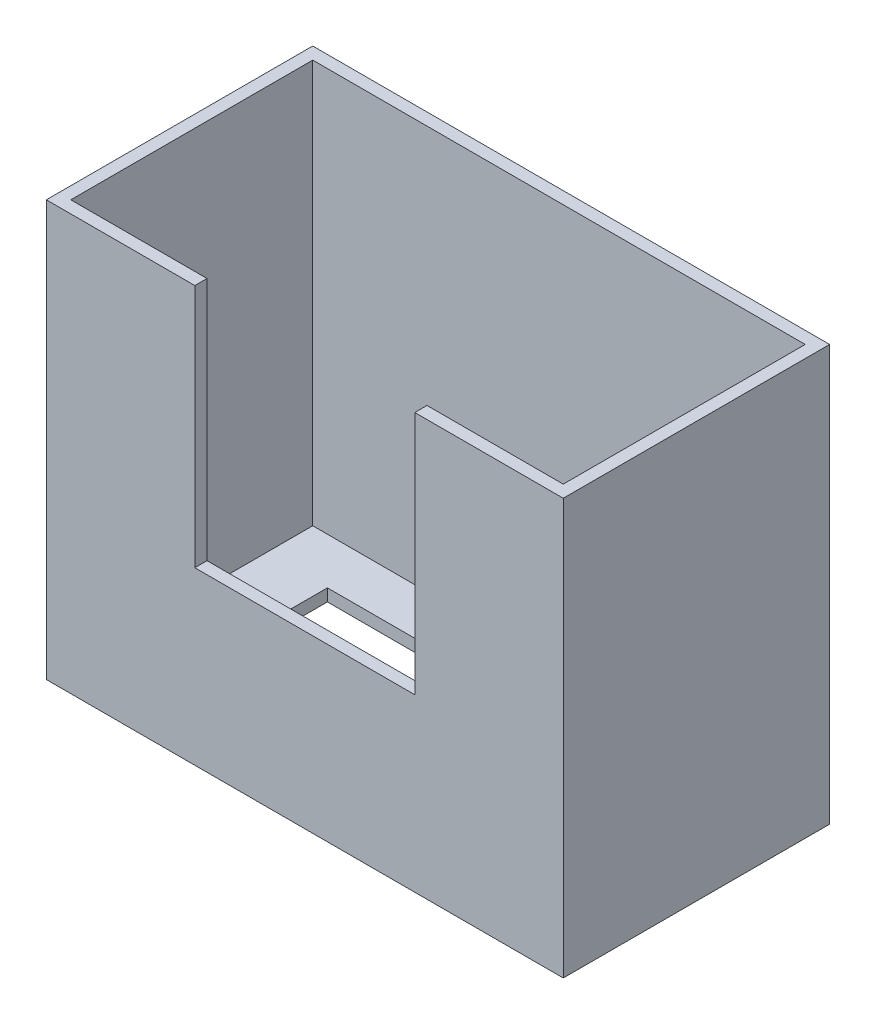
ISO-10303-21;
HEADER;
FILE_DESCRIPTION(('STEP AP214'),'2;1');
FILE_NAME('part.step','',(''),(''),'','','');
FILE_SCHEMA(('AUTOMOTIVE_DESIGN { 1 0 10303 214 1 1 1 1 }'));
ENDSEC;
DATA;
#1=APPLICATION_CONTEXT('core data for automotive mechanical design processes');
#2=APPLICATION_PROTOCOL_DEFINITION('international standard','automotive_design',2000,#1);
#3=PRODUCT_CONTEXT('',#1,'mechanical');
#4=PRODUCT('Part','Part','',(#3));
#5=PRODUCT_RELATED_PRODUCT_CATEGORY('part','',(#4));
#6=PRODUCT_DEFINITION_FORMATION('','',#4);
#7=PRODUCT_DEFINITION_CONTEXT('part definition',#1,'design');
#8=PRODUCT_DEFINITION('design','',#6,#7);
#9=PRODUCT_DEFINITION_SHAPE('','',#8);
#10=(LENGTH_UNIT() NAMED_UNIT(*) SI_UNIT(.MILLI.,.METRE.));
#11=(NAMED_UNIT(*) PLANE_ANGLE_UNIT() SI_UNIT($,.RADIAN.));
#12=(NAMED_UNIT(*) SI_UNIT($,.STERADIAN.) SOLID_ANGLE_UNIT());
#13=UNCERTAINTY_MEASURE_WITH_UNIT(LENGTH_MEASURE(1.E-05),#10,'distance_accuracy_value','');
#14=(GEOMETRIC_REPRESENTATION_CONTEXT(3) GLOBAL_UNCERTAINTY_ASSIGNED_CONTEXT((#13)) GLOBAL_UNIT_ASSIGNED_CONTEXT((#10,
#11,#12)) REPRESENTATION_CONTEXT('',''));
#15=CARTESIAN_POINT('',(0.,0.,0.));
#16=DIRECTION('',(0.,0.,1.));
#17=DIRECTION('',(1.,0.,0.));
#18=AXIS2_PLACEMENT_3D('',#15,#16,#17);
#19=CARTESIAN_POINT('',(0.,0.,0.));
#20=DIRECTION('',(0.,-1.,0.));
#21=DIRECTION('',(0.,0.,-1.));
#22=AXIS2_PLACEMENT_3D('',#19,#20,#21);
#23=PLANE('',#22);
#24=DIRECTION('',(0.,0.,1.));
#25=VECTOR('',#24,1.);
#26=CARTESIAN_POINT('',(0.,0.,0.));
#27=LINE('',#26,#25);
#28=CARTESIAN_POINT('',(2.22044604925031E-13,0.,-99.));
#29=VERTEX_POINT('',#28);
#30=CARTESIAN_POINT('',(0.,0.,0.));
#31=VERTEX_POINT('',#30);
#32=EDGE_CURVE('E233',#29,#31,#27,.T.);
#33=ORIENTED_EDGE('',*,*,#32,.T.);
#34=DIRECTION('',(1.,0.,0.));
#35=VECTOR('',#34,1.);
#36=CARTESIAN_POINT('',(0.,0.,0.));
#37=LINE('',#36,#35);
#38=CARTESIAN_POINT('',(201.5,0.,0.));
#39=VERTEX_POINT('',#38);
#40=EDGE_CURVE('E236',#31,#39,#37,.T.);
#41=ORIENTED_EDGE('',*,*,#40,.T.);
#42=DIRECTION('',(0.,0.,-1.));
#43=VECTOR('',#42,1.);
#44=CARTESIAN_POINT('',(201.5,0.,0.));
#45=LINE('',#44,#43);
#46=CARTESIAN_POINT('',(201.5,0.,-99.));
#47=VERTEX_POINT('',#46);
#48=EDGE_CURVE('E238',#39,#47,#45,.T.);
#49=ORIENTED_EDGE('',*,*,#48,.T.);
#50=DIRECTION('',(-1.,0.,0.));
#51=VECTOR('',#50,1.);
#52=CARTESIAN_POINT('',(2.22044604925031E-13,0.,-99.));
#53=LINE('',#52,#51);
#54=EDGE_CURVE('E224',#47,#29,#53,.T.);
#55=ORIENTED_EDGE('',*,*,#54,.T.);
#56=EDGE_LOOP('',(#33,#41,#49,#55));
#57=FACE_BOUND('',#56,.T.);
#58=DIRECTION('',(0.,0.,-1.));
#59=VECTOR('',#58,1.);
#60=CARTESIAN_POINT('',(175.,0.,-80.));
#61=LINE('',#60,#59);
#62=CARTESIAN_POINT('',(175.,0.,-40.));
#63=VERTEX_POINT('',#62);
#64=CARTESIAN_POINT('',(175.,0.,-80.));
#65=VERTEX_POINT('',#64);
#66=EDGE_CURVE('E214',#63,#65,#61,.T.);
#67=ORIENTED_EDGE('',*,*,#66,.F.);
#68=DIRECTION('',(1.,0.,0.));
#69=VECTOR('',#68,1.);
#70=CARTESIAN_POINT('',(25.0000000000002,0.,-40.));
#71=LINE('',#70,#69);
#72=CARTESIAN_POINT('',(25.0000000000002,0.,-40.));
#73=VERTEX_POINT('',#72);
#74=EDGE_CURVE('E216',#73,#63,#71,.T.);
#75=ORIENTED_EDGE('',*,*,#74,.F.);
#76=DIRECTION('',(0.,0.,1.));
#77=VECTOR('',#76,1.);
#78=CARTESIAN_POINT('',(25.0000000000002,0.,-80.));
#79=LINE('',#78,#77);
#80=CARTESIAN_POINT('',(25.0000000000002,0.,-80.));
#81=VERTEX_POINT('',#80);
#82=EDGE_CURVE('E57',#81,#73,#79,.T.);
#83=ORIENTED_EDGE('',*,*,#82,.F.);
#84=DIRECTION('',(-1.,0.,0.));
#85=VECTOR('',#84,1.);
#86=CARTESIAN_POINT('',(25.0000000000002,0.,-80.));
#87=LINE('',#86,#85);
#88=EDGE_CURVE('E289',#65,#81,#87,.T.);
#89=ORIENTED_EDGE('',*,*,#88,.F.);
#90=EDGE_LOOP('',(#67,#75,#83,#89));
#91=FACE_BOUND('',#90,.T.);
#92=ADVANCED_FACE('F34',(#57,#91),#23,.F.);
#93=CARTESIAN_POINT('',(0.,165.,0.));
#94=DIRECTION('',(0.,-1.,0.));
#95=DIRECTION('',(0.,0.,-1.));
#96=AXIS2_PLACEMENT_3D('',#93,#94,#95);
#97=PLANE('',#96);
#98=DIRECTION('',(1.,0.,0.));
#99=VECTOR('',#98,1.);
#100=CARTESIAN_POINT('',(0.,165.,5.));
#101=LINE('',#100,#99);
#102=CARTESIAN_POINT('',(-5.00000000000001,165.,5.));
#103=VERTEX_POINT('',#102);
#104=CARTESIAN_POINT('',(55.7500000000001,165.,5.));
#105=VERTEX_POINT('',#104);
#106=EDGE_CURVE('E165',#103,#105,#101,.T.);
#107=ORIENTED_EDGE('',*,*,#106,.T.);
#108=DIRECTION('',(0.,0.,1.));
#109=VECTOR('',#108,1.);
#110=CARTESIAN_POINT('',(55.7500000000001,165.,-104.001));
#111=LINE('',#110,#109);
#112=CARTESIAN_POINT('',(55.7500000000001,165.,0.));
#113=VERTEX_POINT('',#112);
#114=EDGE_CURVE('E147',#113,#105,#111,.T.);
#115=ORIENTED_EDGE('',*,*,#114,.F.);
#116=DIRECTION('',(1.,0.,0.));
#117=VECTOR('',#116,1.);
#118=CARTESIAN_POINT('',(0.,165.,0.));
#119=LINE('',#118,#117);
#120=CARTESIAN_POINT('',(0.,165.,0.));
#121=VERTEX_POINT('',#120);
#122=EDGE_CURVE('E225',#121,#113,#119,.T.);
#123=ORIENTED_EDGE('',*,*,#122,.F.);
#124=DIRECTION('',(0.,0.,1.));
#125=VECTOR('',#124,1.);
#126=CARTESIAN_POINT('',(0.,165.,0.));
#127=LINE('',#126,#125);
#128=CARTESIAN_POINT('',(2.22044604925031E-13,165.,-99.));
#129=VERTEX_POINT('',#128);
#130=EDGE_CURVE('E221',#129,#121,#127,.T.);
#131=ORIENTED_EDGE('',*,*,#130,.F.);
#132=DIRECTION('',(-1.,0.,0.));
#133=VECTOR('',#132,1.);
#134=CARTESIAN_POINT('',(2.22044604925031E-13,165.,-99.));
#135=LINE('',#134,#133);
#136=CARTESIAN_POINT('',(201.5,165.,-99.));
#137=VERTEX_POINT('',#136);
#138=EDGE_CURVE('E230',#137,#129,#135,.T.);
#139=ORIENTED_EDGE('',*,*,#138,.F.);
#140=DIRECTION('',(0.,0.,-1.));
#141=VECTOR('',#140,1.);
#142=CARTESIAN_POINT('',(201.5,165.,0.));
#143=LINE('',#142,#141);
#144=CARTESIAN_POINT('',(201.5,165.,0.));
#145=VERTEX_POINT('',#144);
#146=EDGE_CURVE('E227',#145,#137,#143,.T.);
#147=ORIENTED_EDGE('',*,*,#146,.F.);
#148=CARTESIAN_POINT('',(145.75,165.,0.));
#149=VERTEX_POINT('',#148);
#150=EDGE_CURVE('E223',#149,#145,#119,.T.);
#151=ORIENTED_EDGE('',*,*,#150,.F.);
#152=DIRECTION('',(0.,0.,1.));
#153=VECTOR('',#152,1.);
#154=CARTESIAN_POINT('',(145.75,165.,-104.001));
#155=LINE('',#154,#153);
#156=CARTESIAN_POINT('',(145.75,165.,5.));
#157=VERTEX_POINT('',#156);
#158=EDGE_CURVE('E285',#149,#157,#155,.T.);
#159=ORIENTED_EDGE('',*,*,#158,.T.);
#160=CARTESIAN_POINT('',(206.5,165.,5.));
#161=VERTEX_POINT('',#160);
#162=EDGE_CURVE('E175',#157,#161,#101,.T.);
#163=ORIENTED_EDGE('',*,*,#162,.T.);
#164=DIRECTION('',(0.,0.,-1.));
#165=VECTOR('',#164,1.);
#166=CARTESIAN_POINT('',(206.5,165.,0.));
#167=LINE('',#166,#165);
#168=CARTESIAN_POINT('',(206.5,165.,-104.));
#169=VERTEX_POINT('',#168);
#170=EDGE_CURVE('E174',#161,#169,#167,.T.);
#171=ORIENTED_EDGE('',*,*,#170,.T.);
#172=DIRECTION('',(-1.,0.,0.));
#173=VECTOR('',#172,1.);
#174=CARTESIAN_POINT('',(0.,165.,-104.));
#175=LINE('',#174,#173);
#176=CARTESIAN_POINT('',(-4.99999999999977,165.,-104.));
#177=VERTEX_POINT('',#176);
#178=EDGE_CURVE('E177',#169,#177,#175,.T.);
#179=ORIENTED_EDGE('',*,*,#178,.T.);
#180=DIRECTION('',(0.,0.,1.));
#181=VECTOR('',#180,1.);
#182=CARTESIAN_POINT('',(-5.,165.,0.));
#183=LINE('',#182,#181);
#184=EDGE_CURVE('E172',#177,#103,#183,.T.);
#185=ORIENTED_EDGE('',*,*,#184,.T.);
#186=EDGE_LOOP('',(#107,#115,#123,#131,#139,#147,#151,#159,#163,#171,#179,#185));
#187=FACE_BOUND('',#186,.T.);
#188=ADVANCED_FACE('F170',(#187),#97,.F.);
#189=CARTESIAN_POINT('',(-5.,165.,0.));
#190=DIRECTION('',(1.,0.,0.));
#191=DIRECTION('',(0.,0.,-1.));
#192=AXIS2_PLACEMENT_3D('',#189,#190,#191);
#193=PLANE('',#192);
#194=DIRECTION('',(0.,0.,1.));
#195=VECTOR('',#194,1.);
#196=CARTESIAN_POINT('',(-5.,-5.,0.));
#197=LINE('',#196,#195);
#198=CARTESIAN_POINT('',(-4.99999999999977,-5.,-104.));
#199=VERTEX_POINT('',#198);
#200=CARTESIAN_POINT('',(-5.00000000000001,-5.,5.));
#201=VERTEX_POINT('',#200);
#202=EDGE_CURVE('E252',#199,#201,#197,.T.);
#203=ORIENTED_EDGE('',*,*,#202,.T.);
#204=DIRECTION('',(0.,-1.,0.));
#205=VECTOR('',#204,1.);
#206=CARTESIAN_POINT('',(-5.00000000000001,165.,5.));
#207=LINE('',#206,#205);
#208=EDGE_CURVE('E187',#103,#201,#207,.T.);
#209=ORIENTED_EDGE('',*,*,#208,.F.);
#210=ORIENTED_EDGE('',*,*,#184,.F.);
#211=DIRECTION('',(0.,-1.,0.));
#212=VECTOR('',#211,1.);
#213=CARTESIAN_POINT('',(-4.99999999999977,165.,-104.));
#214=LINE('',#213,#212);
#215=EDGE_CURVE('E183',#177,#199,#214,.T.);
#216=ORIENTED_EDGE('',*,*,#215,.T.);
#217=EDGE_LOOP('',(#203,#209,#210,#216));
#218=FACE_BOUND('',#217,.T.);
#219=ADVANCED_FACE('F277',(#218),#193,.F.);
#220=CARTESIAN_POINT('',(0.,165.,5.));
#221=DIRECTION('',(0.,0.,-1.));
#222=DIRECTION('',(-1.,0.,0.));
#223=AXIS2_PLACEMENT_3D('',#220,#221,#222);
#224=PLANE('',#223);
#225=DIRECTION('',(1.,0.,0.));
#226=VECTOR('',#225,1.);
#227=CARTESIAN_POINT('',(55.7500000000001,65.,5.));
#228=LINE('',#227,#226);
#229=CARTESIAN_POINT('',(55.7500000000001,65.,5.));
#230=VERTEX_POINT('',#229);
#231=CARTESIAN_POINT('',(145.75,65.,5.));
#232=VERTEX_POINT('',#231);
#233=EDGE_CURVE('E168',#230,#232,#228,.T.);
#234=ORIENTED_EDGE('',*,*,#233,.F.);
#235=DIRECTION('',(0.,-1.,0.));
#236=VECTOR('',#235,1.);
#237=CARTESIAN_POINT('',(55.7500000000001,165.,5.));
#238=LINE('',#237,#236);
#239=EDGE_CURVE('E151',#105,#230,#238,.T.);
#240=ORIENTED_EDGE('',*,*,#239,.F.);
#241=ORIENTED_EDGE('',*,*,#106,.F.);
#242=ORIENTED_EDGE('',*,*,#208,.T.);
#243=DIRECTION('',(1.,0.,0.));
#244=VECTOR('',#243,1.);
#245=CARTESIAN_POINT('',(0.,-5.,5.));
#246=LINE('',#245,#244);
#247=CARTESIAN_POINT('',(206.5,-5.,5.));
#248=VERTEX_POINT('',#247);
#249=EDGE_CURVE('E255',#201,#248,#246,.T.);
#250=ORIENTED_EDGE('',*,*,#249,.T.);
#251=DIRECTION('',(0.,-1.,0.));
#252=VECTOR('',#251,1.);
#253=CARTESIAN_POINT('',(206.5,165.,5.));
#254=LINE('',#253,#252);
#255=EDGE_CURVE('E257',#161,#248,#254,.T.);
#256=ORIENTED_EDGE('',*,*,#255,.F.);
#257=ORIENTED_EDGE('',*,*,#162,.F.);
#258=DIRECTION('',(0.,1.,0.));
#259=VECTOR('',#258,1.);
#260=CARTESIAN_POINT('',(145.75,165.,5.));
#261=LINE('',#260,#259);
#262=EDGE_CURVE('E286',#232,#157,#261,.T.);
#263=ORIENTED_EDGE('',*,*,#262,.F.);
#264=EDGE_LOOP('',(#234,#240,#241,#242,#250,#256,#257,#263));
#265=FACE_BOUND('',#264,.T.);
#266=ADVANCED_FACE('F163',(#265),#224,.F.);
#267=CARTESIAN_POINT('',(206.5,165.,0.));
#268=DIRECTION('',(-1.,0.,0.));
#269=DIRECTION('',(0.,0.,1.));
#270=AXIS2_PLACEMENT_3D('',#267,#268,#269);
#271=PLANE('',#270);
#272=DIRECTION('',(0.,0.,-1.));
#273=VECTOR('',#272,1.);
#274=CARTESIAN_POINT('',(206.5,-5.,0.));
#275=LINE('',#274,#273);
#276=CARTESIAN_POINT('',(206.5,-5.,-104.));
#277=VERTEX_POINT('',#276);
#278=EDGE_CURVE('E262',#248,#277,#275,.T.);
#279=ORIENTED_EDGE('',*,*,#278,.T.);
#280=DIRECTION('',(0.,-1.,0.));
#281=VECTOR('',#280,1.);
#282=CARTESIAN_POINT('',(206.5,165.,-104.));
#283=LINE('',#282,#281);
#284=EDGE_CURVE('E260',#169,#277,#283,.T.);
#285=ORIENTED_EDGE('',*,*,#284,.F.);
#286=ORIENTED_EDGE('',*,*,#170,.F.);
#287=ORIENTED_EDGE('',*,*,#255,.T.);
#288=EDGE_LOOP('',(#279,#285,#286,#287));
#289=FACE_BOUND('',#288,.T.);
#290=ADVANCED_FACE('F282',(#289),#271,.F.);
#291=CARTESIAN_POINT('',(2.22044604925031E-13,165.,-104.));
#292=DIRECTION('',(0.,0.,1.));
#293=DIRECTION('',(1.,0.,0.));
#294=AXIS2_PLACEMENT_3D('',#291,#292,#293);
#295=PLANE('',#294);
#296=DIRECTION('',(-1.,0.,0.));
#297=VECTOR('',#296,1.);
#298=CARTESIAN_POINT('',(0.,-5.,-104.));
#299=LINE('',#298,#297);
#300=EDGE_CURVE('E266',#277,#199,#299,.T.);
#301=ORIENTED_EDGE('',*,*,#300,.T.);
#302=ORIENTED_EDGE('',*,*,#215,.F.);
#303=ORIENTED_EDGE('',*,*,#178,.F.);
#304=ORIENTED_EDGE('',*,*,#284,.T.);
#305=EDGE_LOOP('',(#301,#302,#303,#304));
#306=FACE_BOUND('',#305,.T.);
#307=ADVANCED_FACE('F271',(#306),#295,.F.);
#308=CARTESIAN_POINT('',(0.,-5.,0.));
#309=DIRECTION('',(0.,-1.,0.));
#310=DIRECTION('',(0.,0.,-1.));
#311=AXIS2_PLACEMENT_3D('',#308,#309,#310);
#312=PLANE('',#311);
#313=DIRECTION('',(0.,0.,1.));
#314=VECTOR('',#313,1.);
#315=CARTESIAN_POINT('',(175.,-5.,-2.42861286636753E-13));
#316=LINE('',#315,#314);
#317=CARTESIAN_POINT('',(175.,-5.,-80.));
#318=VERTEX_POINT('',#317);
#319=CARTESIAN_POINT('',(175.,-5.,-40.));
#320=VERTEX_POINT('',#319);
#321=EDGE_CURVE('E11',#318,#320,#316,.T.);
#322=ORIENTED_EDGE('',*,*,#321,.F.);
#323=DIRECTION('',(1.,0.,0.));
#324=VECTOR('',#323,1.);
#325=CARTESIAN_POINT('',(0.,-5.,-80.));
#326=LINE('',#325,#324);
#327=CARTESIAN_POINT('',(25.0000000000002,-5.,-80.));
#328=VERTEX_POINT('',#327);
#329=EDGE_CURVE('E184',#328,#318,#326,.T.);
#330=ORIENTED_EDGE('',*,*,#329,.F.);
#331=DIRECTION('',(0.,0.,-1.));
#332=VECTOR('',#331,1.);
#333=CARTESIAN_POINT('',(25.0000000000002,-5.,0.));
#334=LINE('',#333,#332);
#335=CARTESIAN_POINT('',(25.0000000000002,-5.,-40.));
#336=VERTEX_POINT('',#335);
#337=EDGE_CURVE('E186',#336,#328,#334,.T.);
#338=ORIENTED_EDGE('',*,*,#337,.F.);
#339=DIRECTION('',(-1.,0.,0.));
#340=VECTOR('',#339,1.);
#341=CARTESIAN_POINT('',(0.,-5.,-40.));
#342=LINE('',#341,#340);
#343=EDGE_CURVE('E42',#320,#336,#342,.T.);
#344=ORIENTED_EDGE('',*,*,#343,.F.);
#345=EDGE_LOOP('',(#322,#330,#338,#344));
#346=FACE_BOUND('',#345,.T.);
#347=ORIENTED_EDGE('',*,*,#202,.F.);
#348=ORIENTED_EDGE('',*,*,#300,.F.);
#349=ORIENTED_EDGE('',*,*,#278,.F.);
#350=ORIENTED_EDGE('',*,*,#249,.F.);
#351=EDGE_LOOP('',(#347,#348,#349,#350));
#352=FACE_BOUND('',#351,.T.);
#353=ADVANCED_FACE('F36',(#346,#352),#312,.T.);
#354=CARTESIAN_POINT('',(0.,165.,0.));
#355=DIRECTION('',(1.,0.,0.));
#356=DIRECTION('',(0.,0.,-1.));
#357=AXIS2_PLACEMENT_3D('',#354,#355,#356);
#358=PLANE('',#357);
#359=ORIENTED_EDGE('',*,*,#32,.F.);
#360=DIRECTION('',(0.,-1.,0.));
#361=VECTOR('',#360,1.);
#362=CARTESIAN_POINT('',(2.22044604925031E-13,165.,-99.));
#363=LINE('',#362,#361);
#364=EDGE_CURVE('E232',#129,#29,#363,.T.);
#365=ORIENTED_EDGE('',*,*,#364,.F.);
#366=ORIENTED_EDGE('',*,*,#130,.T.);
#367=DIRECTION('',(0.,-1.,0.));
#368=VECTOR('',#367,1.);
#369=CARTESIAN_POINT('',(0.,165.,0.));
#370=LINE('',#369,#368);
#371=EDGE_CURVE('E249',#121,#31,#370,.T.);
#372=ORIENTED_EDGE('',*,*,#371,.T.);
#373=EDGE_LOOP('',(#359,#365,#366,#372));
#374=FACE_BOUND('',#373,.T.);
#375=ADVANCED_FACE('F325',(#374),#358,.T.);
#376=CARTESIAN_POINT('',(0.,165.,0.));
#377=DIRECTION('',(0.,0.,-1.));
#378=DIRECTION('',(-1.,0.,0.));
#379=AXIS2_PLACEMENT_3D('',#376,#377,#378);
#380=PLANE('',#379);
#381=DIRECTION('',(0.,-1.,0.));
#382=VECTOR('',#381,1.);
#383=CARTESIAN_POINT('',(55.7500000000001,165.,0.));
#384=LINE('',#383,#382);
#385=CARTESIAN_POINT('',(55.7500000000001,65.,0.));
#386=VERTEX_POINT('',#385);
#387=EDGE_CURVE('E154',#113,#386,#384,.T.);
#388=ORIENTED_EDGE('',*,*,#387,.T.);
#389=DIRECTION('',(1.,0.,0.));
#390=VECTOR('',#389,1.);
#391=CARTESIAN_POINT('',(55.7500000000001,65.,0.));
#392=LINE('',#391,#390);
#393=CARTESIAN_POINT('',(145.75,65.,0.));
#394=VERTEX_POINT('',#393);
#395=EDGE_CURVE('E293',#386,#394,#392,.T.);
#396=ORIENTED_EDGE('',*,*,#395,.T.);
#397=DIRECTION('',(0.,1.,0.));
#398=VECTOR('',#397,1.);
#399=CARTESIAN_POINT('',(145.75,165.,0.));
#400=LINE('',#399,#398);
#401=EDGE_CURVE('E159',#394,#149,#400,.T.);
#402=ORIENTED_EDGE('',*,*,#401,.T.);
#403=ORIENTED_EDGE('',*,*,#150,.T.);
#404=DIRECTION('',(0.,-1.,0.));
#405=VECTOR('',#404,1.);
#406=CARTESIAN_POINT('',(201.5,165.,0.));
#407=LINE('',#406,#405);
#408=EDGE_CURVE('E246',#145,#39,#407,.T.);
#409=ORIENTED_EDGE('',*,*,#408,.T.);
#410=ORIENTED_EDGE('',*,*,#40,.F.);
#411=ORIENTED_EDGE('',*,*,#371,.F.);
#412=ORIENTED_EDGE('',*,*,#122,.T.);
#413=EDGE_LOOP('',(#388,#396,#402,#403,#409,#410,#411,#412));
#414=FACE_BOUND('',#413,.T.);
#415=ADVANCED_FACE('F321',(#414),#380,.T.);
#416=CARTESIAN_POINT('',(201.5,165.,0.));
#417=DIRECTION('',(-1.,0.,0.));
#418=DIRECTION('',(0.,0.,1.));
#419=AXIS2_PLACEMENT_3D('',#416,#417,#418);
#420=PLANE('',#419);
#421=ORIENTED_EDGE('',*,*,#48,.F.);
#422=ORIENTED_EDGE('',*,*,#408,.F.);
#423=ORIENTED_EDGE('',*,*,#146,.T.);
#424=DIRECTION('',(0.,-1.,0.));
#425=VECTOR('',#424,1.);
#426=CARTESIAN_POINT('',(201.5,165.,-99.));
#427=LINE('',#426,#425);
#428=EDGE_CURVE('E243',#137,#47,#427,.T.);
#429=ORIENTED_EDGE('',*,*,#428,.T.);
#430=EDGE_LOOP('',(#421,#422,#423,#429));
#431=FACE_BOUND('',#430,.T.);
#432=ADVANCED_FACE('F317',(#431),#420,.T.);
#433=CARTESIAN_POINT('',(2.22044604925031E-13,165.,-99.));
#434=DIRECTION('',(0.,0.,1.));
#435=DIRECTION('',(1.,0.,0.));
#436=AXIS2_PLACEMENT_3D('',#433,#434,#435);
#437=PLANE('',#436);
#438=ORIENTED_EDGE('',*,*,#54,.F.);
#439=ORIENTED_EDGE('',*,*,#428,.F.);
#440=ORIENTED_EDGE('',*,*,#138,.T.);
#441=ORIENTED_EDGE('',*,*,#364,.T.);
#442=EDGE_LOOP('',(#438,#439,#440,#441));
#443=FACE_BOUND('',#442,.T.);
#444=ADVANCED_FACE('F314',(#443),#437,.T.);
#445=CARTESIAN_POINT('',(175.,-165.,-80.));
#446=DIRECTION('',(1.,0.,0.));
#447=DIRECTION('',(0.,0.,-1.));
#448=AXIS2_PLACEMENT_3D('',#445,#446,#447);
#449=PLANE('',#448);
#450=ORIENTED_EDGE('',*,*,#321,.T.);
#451=DIRECTION('',(0.,1.,0.));
#452=VECTOR('',#451,1.);
#453=CARTESIAN_POINT('',(175.,-165.,-40.));
#454=LINE('',#453,#452);
#455=EDGE_CURVE('E196',#320,#63,#454,.T.);
#456=ORIENTED_EDGE('',*,*,#455,.T.);
#457=ORIENTED_EDGE('',*,*,#66,.T.);
#458=DIRECTION('',(0.,1.,0.));
#459=VECTOR('',#458,1.);
#460=CARTESIAN_POINT('',(175.,-165.,-80.));
#461=LINE('',#460,#459);
#462=EDGE_CURVE('E209',#318,#65,#461,.T.);
#463=ORIENTED_EDGE('',*,*,#462,.F.);
#464=EDGE_LOOP('',(#450,#456,#457,#463));
#465=FACE_BOUND('',#464,.T.);
#466=ADVANCED_FACE('F212',(#465),#449,.F.);
#467=CARTESIAN_POINT('',(25.0000000000002,-165.,-40.));
#468=DIRECTION('',(0.,0.,1.));
#469=DIRECTION('',(1.,0.,0.));
#470=AXIS2_PLACEMENT_3D('',#467,#468,#469);
#471=PLANE('',#470);
#472=ORIENTED_EDGE('',*,*,#343,.T.);
#473=DIRECTION('',(0.,1.,0.));
#474=VECTOR('',#473,1.);
#475=CARTESIAN_POINT('',(25.0000000000002,-165.,-40.));
#476=LINE('',#475,#474);
#477=EDGE_CURVE('E194',#336,#73,#476,.T.);
#478=ORIENTED_EDGE('',*,*,#477,.T.);
#479=ORIENTED_EDGE('',*,*,#74,.T.);
#480=ORIENTED_EDGE('',*,*,#455,.F.);
#481=EDGE_LOOP('',(#472,#478,#479,#480));
#482=FACE_BOUND('',#481,.T.);
#483=ADVANCED_FACE('F192',(#482),#471,.F.);
#484=CARTESIAN_POINT('',(25.0000000000002,-165.,-80.));
#485=DIRECTION('',(-1.,0.,0.));
#486=DIRECTION('',(0.,0.,1.));
#487=AXIS2_PLACEMENT_3D('',#484,#485,#486);
#488=PLANE('',#487);
#489=ORIENTED_EDGE('',*,*,#337,.T.);
#490=DIRECTION('',(0.,1.,0.));
#491=VECTOR('',#490,1.);
#492=CARTESIAN_POINT('',(25.0000000000002,-165.,-80.));
#493=LINE('',#492,#491);
#494=EDGE_CURVE('E202',#328,#81,#493,.T.);
#495=ORIENTED_EDGE('',*,*,#494,.T.);
#496=ORIENTED_EDGE('',*,*,#82,.T.);
#497=ORIENTED_EDGE('',*,*,#477,.F.);
#498=EDGE_LOOP('',(#489,#495,#496,#497));
#499=FACE_BOUND('',#498,.T.);
#500=ADVANCED_FACE('F200',(#499),#488,.F.);
#501=CARTESIAN_POINT('',(25.0000000000002,-165.,-80.));
#502=DIRECTION('',(0.,0.,-1.));
#503=DIRECTION('',(-1.,0.,0.));
#504=AXIS2_PLACEMENT_3D('',#501,#502,#503);
#505=PLANE('',#504);
#506=ORIENTED_EDGE('',*,*,#329,.T.);
#507=ORIENTED_EDGE('',*,*,#462,.T.);
#508=ORIENTED_EDGE('',*,*,#88,.T.);
#509=ORIENTED_EDGE('',*,*,#494,.F.);
#510=EDGE_LOOP('',(#506,#507,#508,#509));
#511=FACE_BOUND('',#510,.T.);
#512=ADVANCED_FACE('F207',(#511),#505,.F.);
#513=CARTESIAN_POINT('',(55.7500000000001,165.,-104.001));
#514=DIRECTION('',(-1.,0.,0.));
#515=DIRECTION('',(0.,-1.,0.));
#516=AXIS2_PLACEMENT_3D('',#513,#514,#515);
#517=PLANE('',#516);
#518=ORIENTED_EDGE('',*,*,#114,.T.);
#519=ORIENTED_EDGE('',*,*,#239,.T.);
#520=DIRECTION('',(0.,0.,1.));
#521=VECTOR('',#520,1.);
#522=CARTESIAN_POINT('',(55.7500000000001,65.,-104.001));
#523=LINE('',#522,#521);
#524=EDGE_CURVE('E160',#386,#230,#523,.T.);
#525=ORIENTED_EDGE('',*,*,#524,.F.);
#526=ORIENTED_EDGE('',*,*,#387,.F.);
#527=EDGE_LOOP('',(#518,#519,#525,#526));
#528=FACE_BOUND('',#527,.T.);
#529=ADVANCED_FACE('F149',(#528),#517,.F.);
#530=CARTESIAN_POINT('',(145.75,165.,-104.001));
#531=DIRECTION('',(1.,0.,0.));
#532=DIRECTION('',(0.,1.,0.));
#533=AXIS2_PLACEMENT_3D('',#530,#531,#532);
#534=PLANE('',#533);
#535=DIRECTION('',(0.,0.,1.));
#536=VECTOR('',#535,1.);
#537=CARTESIAN_POINT('',(145.75,65.,-104.001));
#538=LINE('',#537,#536);
#539=EDGE_CURVE('E49',#394,#232,#538,.T.);
#540=ORIENTED_EDGE('',*,*,#539,.T.);
#541=ORIENTED_EDGE('',*,*,#262,.T.);
#542=ORIENTED_EDGE('',*,*,#158,.F.);
#543=ORIENTED_EDGE('',*,*,#401,.F.);
#544=EDGE_LOOP('',(#540,#541,#542,#543));
#545=FACE_BOUND('',#544,.T.);
#546=ADVANCED_FACE('F387',(#545),#534,.F.);
#547=CARTESIAN_POINT('',(55.7500000000001,65.,-104.001));
#548=DIRECTION('',(0.,-1.,0.));
#549=DIRECTION('',(1.,0.,0.));
#550=AXIS2_PLACEMENT_3D('',#547,#548,#549);
#551=PLANE('',#550);
#552=ORIENTED_EDGE('',*,*,#524,.T.);
#553=ORIENTED_EDGE('',*,*,#233,.T.);
#554=ORIENTED_EDGE('',*,*,#539,.F.);
#555=ORIENTED_EDGE('',*,*,#395,.F.);
#556=EDGE_LOOP('',(#552,#553,#554,#555));
#557=FACE_BOUND('',#556,.T.);
#558=ADVANCED_FACE('F394',(#557),#551,.F.);
#559=CLOSED_SHELL('',(#92,#188,#219,#266,#290,#307,#353,#375,#415,#432,#444,#466,#483,#500,#512,
#529,#546,#558));
#560=MANIFOLD_SOLID_BREP('B2',#559);
#561=ADVANCED_BREP_SHAPE_REPRESENTATION('',(#18,#560),#14);
#562=SHAPE_DEFINITION_REPRESENTATION(#9,#561);
ENDSEC;
END-ISO-10303-21;
